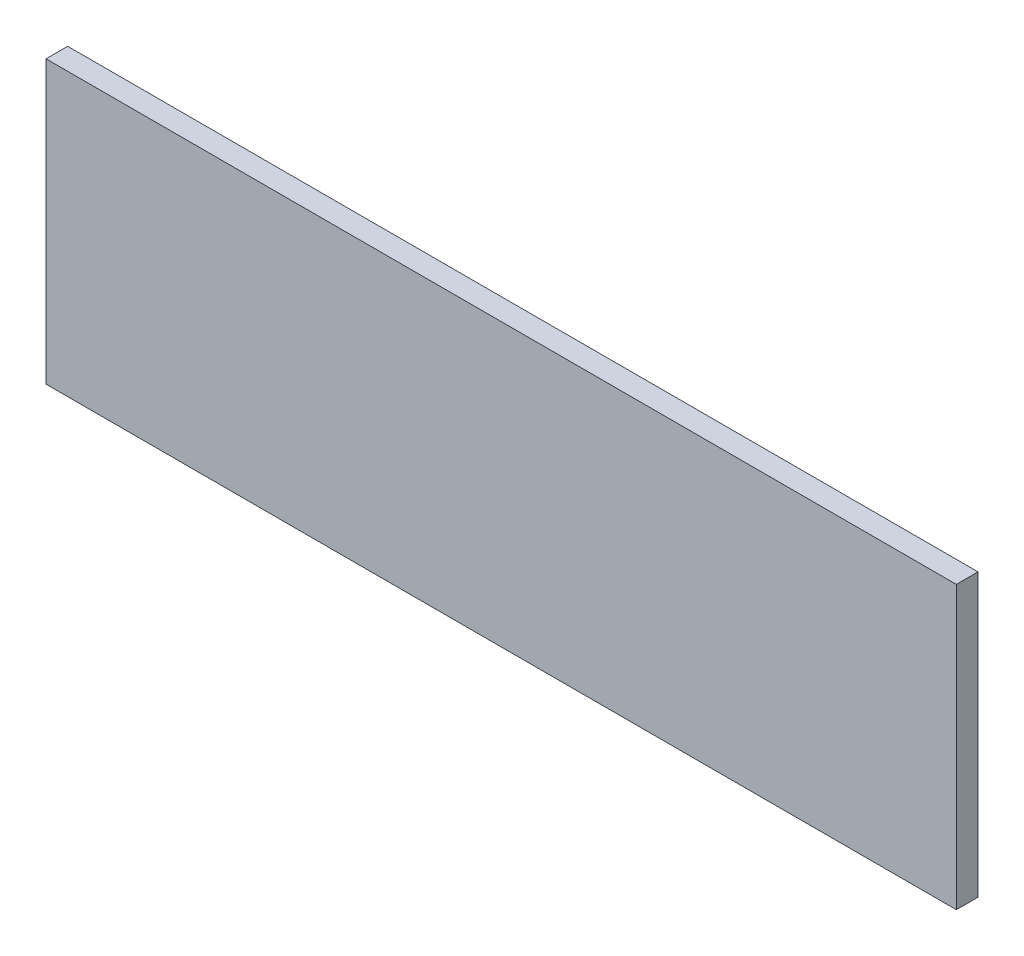
ISO-10303-21;
HEADER;
FILE_DESCRIPTION(('STEP AP214'),'2;1');
FILE_NAME('part.step','',(''),(''),'','','');
FILE_SCHEMA(('AUTOMOTIVE_DESIGN { 1 0 10303 214 1 1 1 1 }'));
ENDSEC;
DATA;
#1=APPLICATION_CONTEXT('core data for automotive mechanical design processes');
#2=APPLICATION_PROTOCOL_DEFINITION('international standard','automotive_design',2000,#1);
#3=PRODUCT_CONTEXT('',#1,'mechanical');
#4=PRODUCT('Part','Part','',(#3));
#5=PRODUCT_RELATED_PRODUCT_CATEGORY('part','',(#4));
#6=PRODUCT_DEFINITION_FORMATION('','',#4);
#7=PRODUCT_DEFINITION_CONTEXT('part definition',#1,'design');
#8=PRODUCT_DEFINITION('design','',#6,#7);
#9=PRODUCT_DEFINITION_SHAPE('','',#8);
#10=(LENGTH_UNIT() NAMED_UNIT(*) SI_UNIT(.MILLI.,.METRE.));
#11=(NAMED_UNIT(*) PLANE_ANGLE_UNIT() SI_UNIT($,.RADIAN.));
#12=(NAMED_UNIT(*) SI_UNIT($,.STERADIAN.) SOLID_ANGLE_UNIT());
#13=UNCERTAINTY_MEASURE_WITH_UNIT(LENGTH_MEASURE(1.E-05),#10,'distance_accuracy_value','');
#14=(GEOMETRIC_REPRESENTATION_CONTEXT(3) GLOBAL_UNCERTAINTY_ASSIGNED_CONTEXT((#13)) GLOBAL_UNIT_ASSIGNED_CONTEXT((#10,
#11,#12)) REPRESENTATION_CONTEXT('',''));
#15=CARTESIAN_POINT('',(0.,0.,0.));
#16=DIRECTION('',(0.,0.,1.));
#17=DIRECTION('',(1.,0.,0.));
#18=AXIS2_PLACEMENT_3D('',#15,#16,#17);
#19=CARTESIAN_POINT('',(-110.,46.7567567567568,5.));
#20=DIRECTION('',(1.,0.,0.));
#21=DIRECTION('',(0.,1.,0.));
#22=AXIS2_PLACEMENT_3D('',#19,#20,#21);
#23=PLANE('',#22);
#24=DIRECTION('',(0.,-1.,0.));
#25=VECTOR('',#24,1.);
#26=CARTESIAN_POINT('',(-110.,46.7567567567568,0.));
#27=LINE('',#26,#25);
#28=CARTESIAN_POINT('',(-110.,46.7567567567568,0.));
#29=VERTEX_POINT('',#28);
#30=CARTESIAN_POINT('',(-110.,-18.2432432432432,0.));
#31=VERTEX_POINT('',#30);
#32=EDGE_CURVE('E98',#29,#31,#27,.T.);
#33=ORIENTED_EDGE('',*,*,#32,.T.);
#34=DIRECTION('',(0.,0.,-1.));
#35=VECTOR('',#34,1.);
#36=CARTESIAN_POINT('',(-110.,-18.2432432432432,5.));
#37=LINE('',#36,#35);
#38=CARTESIAN_POINT('',(-110.,-18.2432432432432,5.));
#39=VERTEX_POINT('',#38);
#40=EDGE_CURVE('E11',#39,#31,#37,.T.);
#41=ORIENTED_EDGE('',*,*,#40,.F.);
#42=DIRECTION('',(0.,-1.,0.));
#43=VECTOR('',#42,1.);
#44=CARTESIAN_POINT('',(-110.,46.7567567567568,5.));
#45=LINE('',#44,#43);
#46=CARTESIAN_POINT('',(-110.,46.7567567567568,5.));
#47=VERTEX_POINT('',#46);
#48=EDGE_CURVE('E86',#47,#39,#45,.T.);
#49=ORIENTED_EDGE('',*,*,#48,.F.);
#50=DIRECTION('',(0.,0.,-1.));
#51=VECTOR('',#50,1.);
#52=CARTESIAN_POINT('',(-110.,46.7567567567568,5.));
#53=LINE('',#52,#51);
#54=EDGE_CURVE('E94',#47,#29,#53,.T.);
#55=ORIENTED_EDGE('',*,*,#54,.T.);
#56=EDGE_LOOP('',(#33,#41,#49,#55));
#57=FACE_BOUND('',#56,.T.);
#58=ADVANCED_FACE('F35',(#57),#23,.F.);
#59=CARTESIAN_POINT('',(-110.,-18.2432432432432,5.));
#60=DIRECTION('',(0.,1.,0.));
#61=DIRECTION('',(0.,0.,1.));
#62=AXIS2_PLACEMENT_3D('',#59,#60,#61);
#63=PLANE('',#62);
#64=DIRECTION('',(1.,0.,0.));
#65=VECTOR('',#64,1.);
#66=CARTESIAN_POINT('',(-110.,-18.2432432432432,0.));
#67=LINE('',#66,#65);
#68=CARTESIAN_POINT('',(100.,-18.2432432432432,0.));
#69=VERTEX_POINT('',#68);
#70=EDGE_CURVE('E90',#31,#69,#67,.T.);
#71=ORIENTED_EDGE('',*,*,#70,.T.);
#72=DIRECTION('',(0.,0.,-1.));
#73=VECTOR('',#72,1.);
#74=CARTESIAN_POINT('',(100.,-18.2432432432432,5.));
#75=LINE('',#74,#73);
#76=CARTESIAN_POINT('',(100.,-18.2432432432432,5.));
#77=VERTEX_POINT('',#76);
#78=EDGE_CURVE('E43',#77,#69,#75,.T.);
#79=ORIENTED_EDGE('',*,*,#78,.F.);
#80=DIRECTION('',(1.,0.,0.));
#81=VECTOR('',#80,1.);
#82=CARTESIAN_POINT('',(-110.,-18.2432432432432,5.));
#83=LINE('',#82,#81);
#84=EDGE_CURVE('E81',#39,#77,#83,.T.);
#85=ORIENTED_EDGE('',*,*,#84,.F.);
#86=ORIENTED_EDGE('',*,*,#40,.T.);
#87=EDGE_LOOP('',(#71,#79,#85,#86));
#88=FACE_BOUND('',#87,.T.);
#89=ADVANCED_FACE('F89',(#88),#63,.F.);
#90=CARTESIAN_POINT('',(100.,46.7567567567568,5.));
#91=DIRECTION('',(-1.,0.,0.));
#92=DIRECTION('',(0.,-1.,0.));
#93=AXIS2_PLACEMENT_3D('',#90,#91,#92);
#94=PLANE('',#93);
#95=DIRECTION('',(0.,1.,0.));
#96=VECTOR('',#95,1.);
#97=CARTESIAN_POINT('',(100.,46.7567567567568,0.));
#98=LINE('',#97,#96);
#99=CARTESIAN_POINT('',(100.,46.7567567567568,0.));
#100=VERTEX_POINT('',#99);
#101=EDGE_CURVE('E68',#69,#100,#98,.T.);
#102=ORIENTED_EDGE('',*,*,#101,.T.);
#103=DIRECTION('',(0.,0.,-1.));
#104=VECTOR('',#103,1.);
#105=CARTESIAN_POINT('',(100.,46.7567567567568,5.));
#106=LINE('',#105,#104);
#107=CARTESIAN_POINT('',(100.,46.7567567567568,5.));
#108=VERTEX_POINT('',#107);
#109=EDGE_CURVE('E91',#108,#100,#106,.T.);
#110=ORIENTED_EDGE('',*,*,#109,.F.);
#111=DIRECTION('',(0.,1.,0.));
#112=VECTOR('',#111,1.);
#113=CARTESIAN_POINT('',(100.,46.7567567567568,5.));
#114=LINE('',#113,#112);
#115=EDGE_CURVE('E84',#77,#108,#114,.T.);
#116=ORIENTED_EDGE('',*,*,#115,.F.);
#117=ORIENTED_EDGE('',*,*,#78,.T.);
#118=EDGE_LOOP('',(#102,#110,#116,#117));
#119=FACE_BOUND('',#118,.T.);
#120=ADVANCED_FACE('F92',(#119),#94,.F.);
#121=CARTESIAN_POINT('',(-110.,46.7567567567568,5.));
#122=DIRECTION('',(0.,-1.,0.));
#123=DIRECTION('',(0.,0.,-1.));
#124=AXIS2_PLACEMENT_3D('',#121,#122,#123);
#125=PLANE('',#124);
#126=DIRECTION('',(-1.,0.,0.));
#127=VECTOR('',#126,1.);
#128=CARTESIAN_POINT('',(-110.,46.7567567567568,0.));
#129=LINE('',#128,#127);
#130=EDGE_CURVE('E74',#100,#29,#129,.T.);
#131=ORIENTED_EDGE('',*,*,#130,.T.);
#132=ORIENTED_EDGE('',*,*,#54,.F.);
#133=DIRECTION('',(-1.,0.,0.));
#134=VECTOR('',#133,1.);
#135=CARTESIAN_POINT('',(-110.,46.7567567567568,5.));
#136=LINE('',#135,#134);
#137=EDGE_CURVE('E51',#108,#47,#136,.T.);
#138=ORIENTED_EDGE('',*,*,#137,.F.);
#139=ORIENTED_EDGE('',*,*,#109,.T.);
#140=EDGE_LOOP('',(#131,#132,#138,#139));
#141=FACE_BOUND('',#140,.T.);
#142=ADVANCED_FACE('F105',(#141),#125,.F.);
#143=CARTESIAN_POINT('',(0.,0.,5.));
#144=DIRECTION('',(0.,0.,1.));
#145=DIRECTION('',(1.,0.,0.));
#146=AXIS2_PLACEMENT_3D('',#143,#144,#145);
#147=PLANE('',#146);
#148=ORIENTED_EDGE('',*,*,#48,.T.);
#149=ORIENTED_EDGE('',*,*,#84,.T.);
#150=ORIENTED_EDGE('',*,*,#115,.T.);
#151=ORIENTED_EDGE('',*,*,#137,.T.);
#152=EDGE_LOOP('',(#148,#149,#150,#151));
#153=FACE_BOUND('',#152,.T.);
#154=ADVANCED_FACE('F82',(#153),#147,.T.);
#155=CARTESIAN_POINT('',(0.,0.,0.));
#156=DIRECTION('',(0.,0.,1.));
#157=DIRECTION('',(1.,0.,0.));
#158=AXIS2_PLACEMENT_3D('',#155,#156,#157);
#159=PLANE('',#158);
#160=ORIENTED_EDGE('',*,*,#32,.F.);
#161=ORIENTED_EDGE('',*,*,#130,.F.);
#162=ORIENTED_EDGE('',*,*,#101,.F.);
#163=ORIENTED_EDGE('',*,*,#70,.F.);
#164=EDGE_LOOP('',(#160,#161,#162,#163));
#165=FACE_BOUND('',#164,.T.);
#166=ADVANCED_FACE('F108',(#165),#159,.F.);
#167=CLOSED_SHELL('',(#58,#89,#120,#142,#154,#166));
#168=MANIFOLD_SOLID_BREP('B2',#167);
#169=ADVANCED_BREP_SHAPE_REPRESENTATION('',(#18,#168),#14);
#170=SHAPE_DEFINITION_REPRESENTATION(#9,#169);
ENDSEC;
END-ISO-10303-21;
